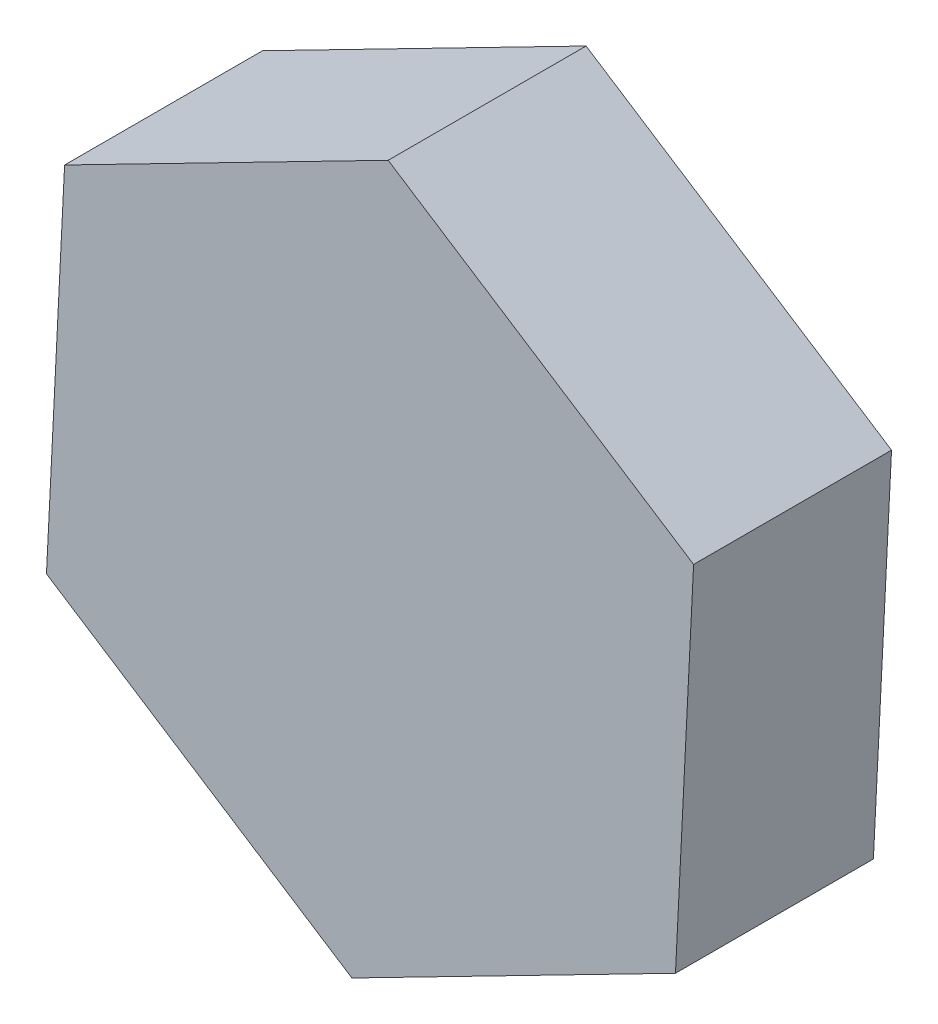
ISO-10303-21;
HEADER;
FILE_DESCRIPTION(('STEP AP214'),'2;1');
FILE_NAME('part.step','',(''),(''),'','','');
FILE_SCHEMA(('AUTOMOTIVE_DESIGN { 1 0 10303 214 1 1 1 1 }'));
ENDSEC;
DATA;
#1=APPLICATION_CONTEXT('core data for automotive mechanical design processes');
#2=APPLICATION_PROTOCOL_DEFINITION('international standard','automotive_design',2000,#1);
#3=PRODUCT_CONTEXT('',#1,'mechanical');
#4=PRODUCT('Part','Part','',(#3));
#5=PRODUCT_RELATED_PRODUCT_CATEGORY('part','',(#4));
#6=PRODUCT_DEFINITION_FORMATION('','',#4);
#7=PRODUCT_DEFINITION_CONTEXT('part definition',#1,'design');
#8=PRODUCT_DEFINITION('design','',#6,#7);
#9=PRODUCT_DEFINITION_SHAPE('','',#8);
#10=(LENGTH_UNIT() NAMED_UNIT(*) SI_UNIT(.MILLI.,.METRE.));
#11=(NAMED_UNIT(*) PLANE_ANGLE_UNIT() SI_UNIT($,.RADIAN.));
#12=(NAMED_UNIT(*) SI_UNIT($,.STERADIAN.) SOLID_ANGLE_UNIT());
#13=UNCERTAINTY_MEASURE_WITH_UNIT(LENGTH_MEASURE(1.E-05),#10,'distance_accuracy_value','');
#14=(GEOMETRIC_REPRESENTATION_CONTEXT(3) GLOBAL_UNCERTAINTY_ASSIGNED_CONTEXT((#13)) GLOBAL_UNIT_ASSIGNED_CONTEXT((#10,
#11,#12)) REPRESENTATION_CONTEXT('',''));
#15=CARTESIAN_POINT('',(0.,0.,0.));
#16=DIRECTION('',(0.,0.,1.));
#17=DIRECTION('',(1.,0.,0.));
#18=AXIS2_PLACEMENT_3D('',#15,#16,#17);
#19=CARTESIAN_POINT('',(-3.596424772,-4.036422503,2.2));
#20=DIRECTION('',(0.,0.,1.));
#21=DIRECTION('',(1.,0.,0.));
#22=AXIS2_PLACEMENT_3D('',#19,#20,#21);
#23=PLANE('',#22);
#24=DIRECTION('',(0.840011011328046,-0.54256935118714,0.));
#25=VECTOR('',#24,1.);
#26=CARTESIAN_POINT('',(-1.8989927295,-2.9400385395,2.2));
#27=LINE('',#26,#25);
#28=CARTESIAN_POINT('',(-3.59642477194368,-1.84365457539213,2.2));
#29=VERTEX_POINT('',#28);
#30=CARTESIAN_POINT('',(-0.201560687228432,-4.0364225023815,2.2));
#31=VERTEX_POINT('',#30);
#32=EDGE_CURVE('E101',#29,#31,#27,.T.);
#33=ORIENTED_EDGE('',*,*,#32,.T.);
#34=DIRECTION('',(0.889884347112085,0.456186199665114,0.));
#35=VECTOR('',#34,1.);
#36=CARTESIAN_POINT('',(1.5966516985,-3.114595215,2.2));
#37=LINE('',#36,#35);
#38=CARTESIAN_POINT('',(3.39486408503599,-2.19276792534143,2.2));
#39=VERTEX_POINT('',#38);
#40=EDGE_CURVE('E100',#31,#39,#37,.T.);
#41=ORIENTED_EDGE('',*,*,#40,.T.);
#42=DIRECTION('',(0.0498733360601318,0.998755550848271,0.));
#43=VECTOR('',#42,1.);
#44=CARTESIAN_POINT('',(3.495644428,-0.1745566755,2.2));
#45=LINE('',#44,#43);
#46=CARTESIAN_POINT('',(3.59642477188736,1.84365457478427,2.2));
#47=VERTEX_POINT('',#46);
#48=EDGE_CURVE('E64',#39,#47,#45,.T.);
#49=ORIENTED_EDGE('',*,*,#48,.T.);
#50=DIRECTION('',(-0.840011011328046,0.54256935118714,0.));
#51=VECTOR('',#50,1.);
#52=CARTESIAN_POINT('',(1.8989927295,2.9400385395,2.2));
#53=LINE('',#52,#51);
#54=CARTESIAN_POINT('',(0.201560687228432,4.0364225023815,2.2));
#55=VERTEX_POINT('',#54);
#56=EDGE_CURVE('E77',#47,#55,#53,.T.);
#57=ORIENTED_EDGE('',*,*,#56,.T.);
#58=DIRECTION('',(-0.889884347112085,-0.456186199665114,0.));
#59=VECTOR('',#58,1.);
#60=CARTESIAN_POINT('',(-1.5966516985,3.114595215,2.2));
#61=LINE('',#60,#59);
#62=CARTESIAN_POINT('',(-3.39486408405496,2.19276792695373,2.2));
#63=VERTEX_POINT('',#62);
#64=EDGE_CURVE('E75',#55,#63,#61,.T.);
#65=ORIENTED_EDGE('',*,*,#64,.T.);
#66=DIRECTION('',(-0.0498733360601318,-0.998755550848271,0.));
#67=VECTOR('',#66,1.);
#68=CARTESIAN_POINT('',(-3.495644428,0.1745566755,2.2));
#69=LINE('',#68,#67);
#70=EDGE_CURVE('E92',#63,#29,#69,.T.);
#71=ORIENTED_EDGE('',*,*,#70,.T.);
#72=EDGE_LOOP('',(#33,#41,#49,#57,#65,#71));
#73=FACE_BOUND('',#72,.T.);
#74=ADVANCED_FACE('F16',(#73),#23,.T.);
#75=CARTESIAN_POINT('',(0.201560687,4.036422503,0.));
#76=DIRECTION('',(-0.54256935118714,-0.840011011328046,0.));
#77=DIRECTION('',(0.840011011328046,-0.54256935118714,0.));
#78=AXIS2_PLACEMENT_3D('',#75,#76,#77);
#79=PLANE('',#78);
#80=DIRECTION('',(0.,0.,1.));
#81=VECTOR('',#80,1.);
#82=CARTESIAN_POINT('',(0.201560687,4.036422503,1.1));
#83=LINE('',#82,#81);
#84=CARTESIAN_POINT('',(0.201560687,4.036422503,0.));
#85=VERTEX_POINT('',#84);
#86=EDGE_CURVE('E79',#85,#55,#83,.T.);
#87=ORIENTED_EDGE('',*,*,#86,.T.);
#88=ORIENTED_EDGE('',*,*,#56,.F.);
#89=DIRECTION('',(0.,0.,-1.));
#90=VECTOR('',#89,1.);
#91=CARTESIAN_POINT('',(3.596424772,1.843654576,1.1));
#92=LINE('',#91,#90);
#93=CARTESIAN_POINT('',(3.596424772,1.843654576,0.));
#94=VERTEX_POINT('',#93);
#95=EDGE_CURVE('E55',#47,#94,#92,.T.);
#96=ORIENTED_EDGE('',*,*,#95,.T.);
#97=DIRECTION('',(0.840011011328046,-0.54256935118714,0.));
#98=VECTOR('',#97,1.);
#99=CARTESIAN_POINT('',(0.201560687,4.036422503,0.));
#100=LINE('',#99,#98);
#101=EDGE_CURVE('E20',#94,#85,#100,.F.);
#102=ORIENTED_EDGE('',*,*,#101,.T.);
#103=EDGE_LOOP('',(#87,#88,#96,#102));
#104=FACE_BOUND('',#103,.T.);
#105=ADVANCED_FACE('F82',(#104),#79,.F.);
#106=CARTESIAN_POINT('',(-3.394864084,2.192767927,0.));
#107=DIRECTION('',(0.456186199665114,-0.889884347112084,0.));
#108=DIRECTION('',(0.889884347112084,0.456186199665114,0.));
#109=AXIS2_PLACEMENT_3D('',#106,#107,#108);
#110=PLANE('',#109);
#111=DIRECTION('',(0.,0.,1.));
#112=VECTOR('',#111,1.);
#113=CARTESIAN_POINT('',(-3.394864084,2.192767927,1.1));
#114=LINE('',#113,#112);
#115=CARTESIAN_POINT('',(-3.394864084,2.192767927,0.));
#116=VERTEX_POINT('',#115);
#117=EDGE_CURVE('E89',#116,#63,#114,.T.);
#118=ORIENTED_EDGE('',*,*,#117,.T.);
#119=ORIENTED_EDGE('',*,*,#64,.F.);
#120=ORIENTED_EDGE('',*,*,#86,.F.);
#121=DIRECTION('',(0.889884347112084,0.456186199665114,0.));
#122=VECTOR('',#121,1.);
#123=CARTESIAN_POINT('',(-3.394864084,2.192767927,0.));
#124=LINE('',#123,#122);
#125=EDGE_CURVE('E116',#85,#116,#124,.F.);
#126=ORIENTED_EDGE('',*,*,#125,.T.);
#127=EDGE_LOOP('',(#118,#119,#120,#126));
#128=FACE_BOUND('',#127,.T.);
#129=ADVANCED_FACE('F87',(#128),#110,.F.);
#130=CARTESIAN_POINT('',(-3.596424772,-1.843654576,0.));
#131=DIRECTION('',(0.998755550848271,-0.0498733360601317,0.));
#132=DIRECTION('',(0.0498733360601317,0.998755550848271,0.));
#133=AXIS2_PLACEMENT_3D('',#130,#131,#132);
#134=PLANE('',#133);
#135=DIRECTION('',(0.,0.,1.));
#136=VECTOR('',#135,1.);
#137=CARTESIAN_POINT('',(-3.596424772,-1.843654576,1.1));
#138=LINE('',#137,#136);
#139=CARTESIAN_POINT('',(-3.596424772,-1.843654576,0.));
#140=VERTEX_POINT('',#139);
#141=EDGE_CURVE('E104',#140,#29,#138,.T.);
#142=ORIENTED_EDGE('',*,*,#141,.T.);
#143=ORIENTED_EDGE('',*,*,#70,.F.);
#144=ORIENTED_EDGE('',*,*,#117,.F.);
#145=DIRECTION('',(0.0498733360601317,0.998755550848271,0.));
#146=VECTOR('',#145,1.);
#147=CARTESIAN_POINT('',(-3.596424772,-1.843654576,0.));
#148=LINE('',#147,#146);
#149=EDGE_CURVE('E115',#116,#140,#148,.F.);
#150=ORIENTED_EDGE('',*,*,#149,.T.);
#151=EDGE_LOOP('',(#142,#143,#144,#150));
#152=FACE_BOUND('',#151,.T.);
#153=ADVANCED_FACE('F120',(#152),#134,.F.);
#154=CARTESIAN_POINT('',(-0.201560687,-4.036422503,0.));
#155=DIRECTION('',(0.54256935118714,0.840011011328046,0.));
#156=DIRECTION('',(-0.840011011328046,0.54256935118714,0.));
#157=AXIS2_PLACEMENT_3D('',#154,#155,#156);
#158=PLANE('',#157);
#159=DIRECTION('',(0.,0.,1.));
#160=VECTOR('',#159,1.);
#161=CARTESIAN_POINT('',(-0.201560687,-4.036422503,1.1));
#162=LINE('',#161,#160);
#163=CARTESIAN_POINT('',(-0.201560687,-4.036422503,0.));
#164=VERTEX_POINT('',#163);
#165=EDGE_CURVE('E97',#164,#31,#162,.T.);
#166=ORIENTED_EDGE('',*,*,#165,.T.);
#167=ORIENTED_EDGE('',*,*,#32,.F.);
#168=ORIENTED_EDGE('',*,*,#141,.F.);
#169=DIRECTION('',(-0.840011011328046,0.54256935118714,0.));
#170=VECTOR('',#169,1.);
#171=CARTESIAN_POINT('',(-0.201560687,-4.036422503,0.));
#172=LINE('',#171,#170);
#173=EDGE_CURVE('E113',#140,#164,#172,.F.);
#174=ORIENTED_EDGE('',*,*,#173,.T.);
#175=EDGE_LOOP('',(#166,#167,#168,#174));
#176=FACE_BOUND('',#175,.T.);
#177=ADVANCED_FACE('F126',(#176),#158,.F.);
#178=CARTESIAN_POINT('',(3.394864084,-2.192767927,0.));
#179=DIRECTION('',(-0.456186199665114,0.889884347112084,0.));
#180=DIRECTION('',(-0.889884347112084,-0.456186199665114,0.));
#181=AXIS2_PLACEMENT_3D('',#178,#179,#180);
#182=PLANE('',#181);
#183=DIRECTION('',(0.,0.,1.));
#184=VECTOR('',#183,1.);
#185=CARTESIAN_POINT('',(3.394864084,-2.192767927,1.1));
#186=LINE('',#185,#184);
#187=CARTESIAN_POINT('',(3.394864084,-2.192767927,0.));
#188=VERTEX_POINT('',#187);
#189=EDGE_CURVE('E102',#188,#39,#186,.T.);
#190=ORIENTED_EDGE('',*,*,#189,.T.);
#191=ORIENTED_EDGE('',*,*,#40,.F.);
#192=ORIENTED_EDGE('',*,*,#165,.F.);
#193=DIRECTION('',(-0.889884347112084,-0.456186199665114,0.));
#194=VECTOR('',#193,1.);
#195=CARTESIAN_POINT('',(3.394864084,-2.192767927,0.));
#196=LINE('',#195,#194);
#197=EDGE_CURVE('E35',#164,#188,#196,.F.);
#198=ORIENTED_EDGE('',*,*,#197,.T.);
#199=EDGE_LOOP('',(#190,#191,#192,#198));
#200=FACE_BOUND('',#199,.T.);
#201=ADVANCED_FACE('F129',(#200),#182,.F.);
#202=CARTESIAN_POINT('',(3.596424772,1.843654576,0.));
#203=DIRECTION('',(-0.998755550848271,0.0498733360601317,0.));
#204=DIRECTION('',(-0.0498733360601317,-0.998755550848271,0.));
#205=AXIS2_PLACEMENT_3D('',#202,#203,#204);
#206=PLANE('',#205);
#207=ORIENTED_EDGE('',*,*,#95,.F.);
#208=ORIENTED_EDGE('',*,*,#48,.F.);
#209=ORIENTED_EDGE('',*,*,#189,.F.);
#210=DIRECTION('',(-0.0498733360601317,-0.998755550848271,0.));
#211=VECTOR('',#210,1.);
#212=CARTESIAN_POINT('',(3.596424772,1.843654576,0.));
#213=LINE('',#212,#211);
#214=EDGE_CURVE('E110',#188,#94,#213,.F.);
#215=ORIENTED_EDGE('',*,*,#214,.T.);
#216=EDGE_LOOP('',(#207,#208,#209,#215));
#217=FACE_BOUND('',#216,.T.);
#218=ADVANCED_FACE('F133',(#217),#206,.F.);
#219=CARTESIAN_POINT('',(-3.639581869,-4.084859573,0.));
#220=DIRECTION('',(0.,0.,1.));
#221=DIRECTION('',(1.,0.,0.));
#222=AXIS2_PLACEMENT_3D('',#219,#220,#221);
#223=PLANE('',#222);
#224=CARTESIAN_POINT('',(0.,0.,0.));
#225=DIRECTION('',(0.,0.,1.));
#226=DIRECTION('',(1.,0.,0.));
#227=AXIS2_PLACEMENT_3D('',#224,#225,#226);
#228=CIRCLE('',#227,2.5);
#229=CARTESIAN_POINT('',(2.5,0.,0.));
#230=VERTEX_POINT('',#229);
#231=EDGE_CURVE('E26',#230,#230,#228,.T.);
#232=ORIENTED_EDGE('',*,*,#231,.T.);
#233=EDGE_LOOP('',(#232));
#234=FACE_BOUND('',#233,.T.);
#235=ORIENTED_EDGE('',*,*,#197,.F.);
#236=ORIENTED_EDGE('',*,*,#173,.F.);
#237=ORIENTED_EDGE('',*,*,#149,.F.);
#238=ORIENTED_EDGE('',*,*,#125,.F.);
#239=ORIENTED_EDGE('',*,*,#101,.F.);
#240=ORIENTED_EDGE('',*,*,#214,.F.);
#241=EDGE_LOOP('',(#235,#236,#237,#238,#239,#240));
#242=FACE_BOUND('',#241,.T.);
#243=ADVANCED_FACE('F123',(#234,#242),#223,.F.);
#244=CARTESIAN_POINT('',(2.53,-2.53,-0.5));
#245=DIRECTION('',(0.,0.,-1.));
#246=DIRECTION('',(-1.,0.,0.));
#247=AXIS2_PLACEMENT_3D('',#244,#245,#246);
#248=PLANE('',#247);
#249=CARTESIAN_POINT('',(0.,0.,-0.5));
#250=DIRECTION('',(0.,0.,1.));
#251=DIRECTION('',(1.,0.,0.));
#252=AXIS2_PLACEMENT_3D('',#249,#250,#251);
#253=CIRCLE('',#252,2.5);
#254=CARTESIAN_POINT('',(2.5,0.,-0.5));
#255=VERTEX_POINT('',#254);
#256=EDGE_CURVE('E10',#255,#255,#253,.F.);
#257=ORIENTED_EDGE('',*,*,#256,.T.);
#258=EDGE_LOOP('',(#257));
#259=FACE_BOUND('',#258,.T.);
#260=ADVANCED_FACE('F18',(#259),#248,.T.);
#261=CARTESIAN_POINT('',(0.,0.,-0.5));
#262=DIRECTION('',(0.,0.,1.));
#263=DIRECTION('',(1.,0.,0.));
#264=AXIS2_PLACEMENT_3D('',#261,#262,#263);
#265=CYLINDRICAL_SURFACE('',#264,2.5);
#266=ORIENTED_EDGE('',*,*,#256,.F.);
#267=EDGE_LOOP('',(#266));
#268=FACE_BOUND('',#267,.T.);
#269=ORIENTED_EDGE('',*,*,#231,.F.);
#270=EDGE_LOOP('',(#269));
#271=FACE_BOUND('',#270,.T.);
#272=ADVANCED_FACE('F143',(#268,#271),#265,.T.);
#273=CLOSED_SHELL('',(#74,#105,#129,#153,#177,#201,#218,#243,#260,#272));
#274=MANIFOLD_SOLID_BREP('B1',#273);
#275=ADVANCED_BREP_SHAPE_REPRESENTATION('',(#18,#274),#14);
#276=SHAPE_DEFINITION_REPRESENTATION(#9,#275);
ENDSEC;
END-ISO-10303-21;
